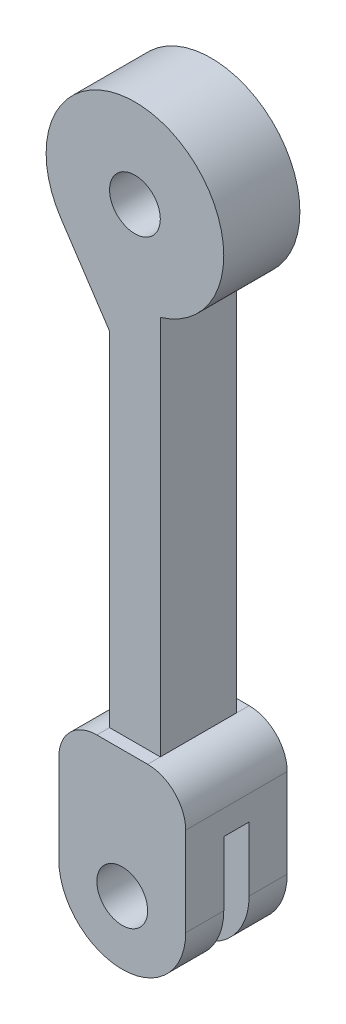
ISO-10303-21;
HEADER;
FILE_DESCRIPTION(('STEP AP214'),'2;1');
FILE_NAME('part.step','',(''),(''),'','','');
FILE_SCHEMA(('AUTOMOTIVE_DESIGN { 1 0 10303 214 1 1 1 1 }'));
ENDSEC;
DATA;
#1=APPLICATION_CONTEXT('core data for automotive mechanical design processes');
#2=APPLICATION_PROTOCOL_DEFINITION('international standard','automotive_design',2000,#1);
#3=PRODUCT_CONTEXT('',#1,'mechanical');
#4=PRODUCT('Part','Part','',(#3));
#5=PRODUCT_RELATED_PRODUCT_CATEGORY('part','',(#4));
#6=PRODUCT_DEFINITION_FORMATION('','',#4);
#7=PRODUCT_DEFINITION_CONTEXT('part definition',#1,'design');
#8=PRODUCT_DEFINITION('design','',#6,#7);
#9=PRODUCT_DEFINITION_SHAPE('','',#8);
#10=(LENGTH_UNIT() NAMED_UNIT(*) SI_UNIT(.MILLI.,.METRE.));
#11=(NAMED_UNIT(*) PLANE_ANGLE_UNIT() SI_UNIT($,.RADIAN.));
#12=(NAMED_UNIT(*) SI_UNIT($,.STERADIAN.) SOLID_ANGLE_UNIT());
#13=UNCERTAINTY_MEASURE_WITH_UNIT(LENGTH_MEASURE(1.E-05),#10,'distance_accuracy_value','');
#14=(GEOMETRIC_REPRESENTATION_CONTEXT(3) GLOBAL_UNCERTAINTY_ASSIGNED_CONTEXT((#13)) GLOBAL_UNIT_ASSIGNED_CONTEXT((#10,
#11,#12)) REPRESENTATION_CONTEXT('',''));
#15=CARTESIAN_POINT('',(0.,0.,0.));
#16=DIRECTION('',(0.,0.,1.));
#17=DIRECTION('',(1.,0.,0.));
#18=AXIS2_PLACEMENT_3D('',#15,#16,#17);
#19=CARTESIAN_POINT('',(0.,0.,4.));
#20=DIRECTION('',(0.,0.,-1.));
#21=DIRECTION('',(-1.,0.,0.));
#22=AXIS2_PLACEMENT_3D('',#19,#20,#21);
#23=CYLINDRICAL_SURFACE('',#22,2.5);
#24=DIRECTION('',(0.,0.,-1.));
#25=VECTOR('',#24,1.);
#26=CARTESIAN_POINT('',(2.5,0.,4.));
#27=LINE('',#26,#25);
#28=CARTESIAN_POINT('',(2.5,0.,1.5));
#29=VERTEX_POINT('',#28);
#30=CARTESIAN_POINT('',(2.5,0.,0.));
#31=VERTEX_POINT('',#30);
#32=EDGE_CURVE('E267',#29,#31,#27,.T.);
#33=ORIENTED_EDGE('',*,*,#32,.F.);
#34=CARTESIAN_POINT('',(0.,0.,1.5));
#35=DIRECTION('',(0.,0.,-1.));
#36=DIRECTION('',(0.,1.,0.));
#37=AXIS2_PLACEMENT_3D('',#34,#35,#36);
#38=CIRCLE('',#37,2.5);
#39=CARTESIAN_POINT('',(-2.5,0.,1.5));
#40=VERTEX_POINT('',#39);
#41=EDGE_CURVE('E151',#29,#40,#38,.T.);
#42=ORIENTED_EDGE('',*,*,#41,.T.);
#43=DIRECTION('',(0.,0.,-1.));
#44=VECTOR('',#43,1.);
#45=CARTESIAN_POINT('',(-2.5,0.,4.));
#46=LINE('',#45,#44);
#47=CARTESIAN_POINT('',(-2.5,0.,0.));
#48=VERTEX_POINT('',#47);
#49=EDGE_CURVE('E235',#40,#48,#46,.T.);
#50=ORIENTED_EDGE('',*,*,#49,.T.);
#51=CARTESIAN_POINT('',(0.,0.,0.));
#52=DIRECTION('',(0.,0.,1.));
#53=DIRECTION('',(1.,0.,0.));
#54=AXIS2_PLACEMENT_3D('',#51,#52,#53);
#55=CIRCLE('',#54,2.5);
#56=EDGE_CURVE('E218',#48,#31,#55,.T.);
#57=ORIENTED_EDGE('',*,*,#56,.T.);
#58=EDGE_LOOP('',(#33,#42,#50,#57));
#59=FACE_BOUND('',#58,.T.);
#60=ADVANCED_FACE('F32',(#59),#23,.T.);
#61=CARTESIAN_POINT('',(0.,0.,4.));
#62=DIRECTION('',(0.,0.,-1.));
#63=DIRECTION('',(-1.,0.,0.));
#64=AXIS2_PLACEMENT_3D('',#61,#62,#63);
#65=CYLINDRICAL_SURFACE('',#64,1.);
#66=CARTESIAN_POINT('',(0.,0.,1.5));
#67=DIRECTION('',(0.,0.,-1.));
#68=DIRECTION('',(0.,1.,0.));
#69=AXIS2_PLACEMENT_3D('',#66,#67,#68);
#70=CIRCLE('',#69,1.);
#71=CARTESIAN_POINT('',(0.,1.,1.5));
#72=VERTEX_POINT('',#71);
#73=EDGE_CURVE('E168',#72,#72,#70,.T.);
#74=ORIENTED_EDGE('',*,*,#73,.F.);
#75=EDGE_LOOP('',(#74));
#76=FACE_BOUND('',#75,.T.);
#77=CARTESIAN_POINT('',(0.,0.,0.));
#78=DIRECTION('',(0.,0.,1.));
#79=DIRECTION('',(1.,0.,0.));
#80=AXIS2_PLACEMENT_3D('',#77,#78,#79);
#81=CIRCLE('',#80,1.);
#82=CARTESIAN_POINT('',(1.,0.,0.));
#83=VERTEX_POINT('',#82);
#84=EDGE_CURVE('E214',#83,#83,#81,.T.);
#85=ORIENTED_EDGE('',*,*,#84,.F.);
#86=EDGE_LOOP('',(#85));
#87=FACE_BOUND('',#86,.T.);
#88=ADVANCED_FACE('F274',(#76,#87),#65,.F.);
#89=CARTESIAN_POINT('',(-0.999999999999989,5.,4.));
#90=DIRECTION('',(0.,-1.,0.));
#91=DIRECTION('',(0.,0.,-1.));
#92=AXIS2_PLACEMENT_3D('',#89,#90,#91);
#93=PLANE('',#92);
#94=DIRECTION('',(-1.,0.,0.));
#95=VECTOR('',#94,1.);
#96=CARTESIAN_POINT('',(-400000.,4.99999999999545,0.5));
#97=LINE('',#96,#95);
#98=CARTESIAN_POINT('',(0.999999999976353,4.99999999999545,0.5));
#99=VERTEX_POINT('',#98);
#100=CARTESIAN_POINT('',(-0.999999999999989,5.,0.5));
#101=VERTEX_POINT('',#100);
#102=EDGE_CURVE('E55',#99,#101,#97,.T.);
#103=ORIENTED_EDGE('',*,*,#102,.F.);
#104=DIRECTION('',(0.,0.,-1.));
#105=VECTOR('',#104,1.);
#106=CARTESIAN_POINT('',(0.99999999999999,5.,4.));
#107=LINE('',#106,#105);
#108=CARTESIAN_POINT('',(0.99999999999999,5.,0.));
#109=VERTEX_POINT('',#108);
#110=EDGE_CURVE('E260',#99,#109,#107,.T.);
#111=ORIENTED_EDGE('',*,*,#110,.T.);
#112=DIRECTION('',(-1.,0.,0.));
#113=VECTOR('',#112,1.);
#114=CARTESIAN_POINT('',(-0.999999999999989,5.,0.));
#115=LINE('',#114,#113);
#116=CARTESIAN_POINT('',(-0.999999999999989,5.,0.));
#117=VERTEX_POINT('',#116);
#118=EDGE_CURVE('E243',#109,#117,#115,.T.);
#119=ORIENTED_EDGE('',*,*,#118,.T.);
#120=DIRECTION('',(0.,0.,-1.));
#121=VECTOR('',#120,1.);
#122=CARTESIAN_POINT('',(-0.999999999999989,5.,4.));
#123=LINE('',#122,#121);
#124=EDGE_CURVE('E256',#101,#117,#123,.T.);
#125=ORIENTED_EDGE('',*,*,#124,.F.);
#126=EDGE_LOOP('',(#103,#111,#119,#125));
#127=FACE_BOUND('',#126,.T.);
#128=ADVANCED_FACE('F277',(#127),#93,.F.);
#129=CARTESIAN_POINT('',(0.,0.,4.));
#130=DIRECTION('',(0.,0.,1.));
#131=DIRECTION('',(1.,0.,0.));
#132=AXIS2_PLACEMENT_3D('',#129,#130,#131);
#133=PLANE('',#132);
#134=CARTESIAN_POINT('',(0.,0.,4.));
#135=DIRECTION('',(0.,0.,1.));
#136=DIRECTION('',(1.,0.,0.));
#137=AXIS2_PLACEMENT_3D('',#134,#135,#136);
#138=CIRCLE('',#137,2.5);
#139=CARTESIAN_POINT('',(-2.5,0.,4.));
#140=VERTEX_POINT('',#139);
#141=CARTESIAN_POINT('',(2.5,0.,4.));
#142=VERTEX_POINT('',#141);
#143=EDGE_CURVE('E221',#140,#142,#138,.T.);
#144=ORIENTED_EDGE('',*,*,#143,.T.);
#145=DIRECTION('',(0.,1.,0.));
#146=VECTOR('',#145,1.);
#147=CARTESIAN_POINT('',(2.5,3.49999999999999,4.));
#148=LINE('',#147,#146);
#149=CARTESIAN_POINT('',(2.5,3.49999999999999,4.));
#150=VERTEX_POINT('',#149);
#151=EDGE_CURVE('E224',#142,#150,#148,.T.);
#152=ORIENTED_EDGE('',*,*,#151,.T.);
#153=CARTESIAN_POINT('',(1.,3.5,4.));
#154=DIRECTION('',(0.,0.,1.));
#155=DIRECTION('',(1.,0.,0.));
#156=AXIS2_PLACEMENT_3D('',#153,#154,#155);
#157=CIRCLE('',#156,1.5);
#158=CARTESIAN_POINT('',(0.99999999999999,5.,4.));
#159=VERTEX_POINT('',#158);
#160=EDGE_CURVE('E227',#150,#159,#157,.T.);
#161=ORIENTED_EDGE('',*,*,#160,.T.);
#162=DIRECTION('',(-1.,0.,0.));
#163=VECTOR('',#162,1.);
#164=CARTESIAN_POINT('',(-0.999999999999989,5.,4.));
#165=LINE('',#164,#163);
#166=CARTESIAN_POINT('',(-0.999999999999989,5.,4.));
#167=VERTEX_POINT('',#166);
#168=EDGE_CURVE('E229',#159,#167,#165,.T.);
#169=ORIENTED_EDGE('',*,*,#168,.T.);
#170=CARTESIAN_POINT('',(-1.,3.5,4.));
#171=DIRECTION('',(0.,0.,1.));
#172=DIRECTION('',(1.,0.,0.));
#173=AXIS2_PLACEMENT_3D('',#170,#171,#172);
#174=CIRCLE('',#173,1.5);
#175=CARTESIAN_POINT('',(-2.5,3.49999999999999,4.));
#176=VERTEX_POINT('',#175);
#177=EDGE_CURVE('E231',#167,#176,#174,.T.);
#178=ORIENTED_EDGE('',*,*,#177,.T.);
#179=DIRECTION('',(0.,-1.,0.));
#180=VECTOR('',#179,1.);
#181=CARTESIAN_POINT('',(-2.5,0.,4.));
#182=LINE('',#181,#180);
#183=EDGE_CURVE('E233',#176,#140,#182,.T.);
#184=ORIENTED_EDGE('',*,*,#183,.T.);
#185=EDGE_LOOP('',(#144,#152,#161,#169,#178,#184));
#186=FACE_BOUND('',#185,.T.);
#187=CARTESIAN_POINT('',(0.,0.,4.));
#188=DIRECTION('',(0.,0.,1.));
#189=DIRECTION('',(1.,0.,0.));
#190=AXIS2_PLACEMENT_3D('',#187,#188,#189);
#191=CIRCLE('',#190,1.);
#192=CARTESIAN_POINT('',(1.,0.,4.));
#193=VERTEX_POINT('',#192);
#194=EDGE_CURVE('E215',#193,#193,#191,.T.);
#195=ORIENTED_EDGE('',*,*,#194,.F.);
#196=EDGE_LOOP('',(#195));
#197=FACE_BOUND('',#196,.T.);
#198=ADVANCED_FACE('F284',(#186,#197),#133,.T.);
#199=CARTESIAN_POINT('',(0.,0.,0.));
#200=DIRECTION('',(0.,0.,1.));
#201=DIRECTION('',(1.,0.,0.));
#202=AXIS2_PLACEMENT_3D('',#199,#200,#201);
#203=PLANE('',#202);
#204=ORIENTED_EDGE('',*,*,#56,.F.);
#205=DIRECTION('',(0.,-1.,0.));
#206=VECTOR('',#205,1.);
#207=CARTESIAN_POINT('',(-2.5,0.,0.));
#208=LINE('',#207,#206);
#209=CARTESIAN_POINT('',(-2.5,3.49999999999999,0.));
#210=VERTEX_POINT('',#209);
#211=EDGE_CURVE('E225',#210,#48,#208,.T.);
#212=ORIENTED_EDGE('',*,*,#211,.F.);
#213=CARTESIAN_POINT('',(-1.,3.5,0.));
#214=DIRECTION('',(0.,0.,1.));
#215=DIRECTION('',(1.,0.,0.));
#216=AXIS2_PLACEMENT_3D('',#213,#214,#215);
#217=CIRCLE('',#216,1.5);
#218=EDGE_CURVE('E246',#117,#210,#217,.T.);
#219=ORIENTED_EDGE('',*,*,#218,.F.);
#220=ORIENTED_EDGE('',*,*,#118,.F.);
#221=CARTESIAN_POINT('',(1.,3.5,0.));
#222=DIRECTION('',(0.,0.,1.));
#223=DIRECTION('',(1.,0.,0.));
#224=AXIS2_PLACEMENT_3D('',#221,#222,#223);
#225=CIRCLE('',#224,1.5);
#226=CARTESIAN_POINT('',(2.5,3.49999999999999,0.));
#227=VERTEX_POINT('',#226);
#228=EDGE_CURVE('E240',#227,#109,#225,.T.);
#229=ORIENTED_EDGE('',*,*,#228,.F.);
#230=DIRECTION('',(0.,1.,0.));
#231=VECTOR('',#230,1.);
#232=CARTESIAN_POINT('',(2.5,3.49999999999999,0.));
#233=LINE('',#232,#231);
#234=EDGE_CURVE('E238',#31,#227,#233,.T.);
#235=ORIENTED_EDGE('',*,*,#234,.F.);
#236=EDGE_LOOP('',(#204,#212,#219,#220,#229,#235));
#237=FACE_BOUND('',#236,.T.);
#238=ORIENTED_EDGE('',*,*,#84,.T.);
#239=EDGE_LOOP('',(#238));
#240=FACE_BOUND('',#239,.T.);
#241=ADVANCED_FACE('F282',(#237,#240),#203,.F.);
#242=CARTESIAN_POINT('',(-2.5,0.,2.5));
#243=VERTEX_POINT('',#242);
#244=EDGE_CURVE('E250',#140,#243,#46,.T.);
#245=ORIENTED_EDGE('',*,*,#244,.T.);
#246=CARTESIAN_POINT('',(0.,0.,2.5));
#247=DIRECTION('',(0.,0.,1.));
#248=DIRECTION('',(0.,-1.,0.));
#249=AXIS2_PLACEMENT_3D('',#246,#247,#248);
#250=CIRCLE('',#249,2.5);
#251=CARTESIAN_POINT('',(2.5,0.,2.5));
#252=VERTEX_POINT('',#251);
#253=EDGE_CURVE('E165',#243,#252,#250,.T.);
#254=ORIENTED_EDGE('',*,*,#253,.T.);
#255=EDGE_CURVE('E40',#142,#252,#27,.T.);
#256=ORIENTED_EDGE('',*,*,#255,.F.);
#257=ORIENTED_EDGE('',*,*,#143,.F.);
#258=EDGE_LOOP('',(#245,#254,#256,#257));
#259=FACE_BOUND('',#258,.T.);
#260=ADVANCED_FACE('F34',(#259),#23,.T.);
#261=CARTESIAN_POINT('',(2.5,3.49999999999999,4.));
#262=DIRECTION('',(-1.,0.,0.));
#263=DIRECTION('',(0.,-1.,0.));
#264=AXIS2_PLACEMENT_3D('',#261,#262,#263);
#265=PLANE('',#264);
#266=DIRECTION('',(0.,0.,1.));
#267=VECTOR('',#266,1.);
#268=CARTESIAN_POINT('',(2.5,2.53048513073797,1.5));
#269=LINE('',#268,#267);
#270=CARTESIAN_POINT('',(2.5,2.53048513073797,1.5));
#271=VERTEX_POINT('',#270);
#272=CARTESIAN_POINT('',(2.5,2.53048513073797,2.5));
#273=VERTEX_POINT('',#272);
#274=EDGE_CURVE('E141',#271,#273,#269,.T.);
#275=ORIENTED_EDGE('',*,*,#274,.F.);
#276=DIRECTION('',(0.,1.,0.));
#277=VECTOR('',#276,1.);
#278=CARTESIAN_POINT('',(2.5,2.53048513073797,1.5));
#279=LINE('',#278,#277);
#280=EDGE_CURVE('E148',#29,#271,#279,.T.);
#281=ORIENTED_EDGE('',*,*,#280,.F.);
#282=ORIENTED_EDGE('',*,*,#32,.T.);
#283=ORIENTED_EDGE('',*,*,#234,.T.);
#284=DIRECTION('',(0.,0.,-1.));
#285=VECTOR('',#284,1.);
#286=CARTESIAN_POINT('',(2.5,3.49999999999999,4.));
#287=LINE('',#286,#285);
#288=EDGE_CURVE('E264',#150,#227,#287,.T.);
#289=ORIENTED_EDGE('',*,*,#288,.F.);
#290=ORIENTED_EDGE('',*,*,#151,.F.);
#291=ORIENTED_EDGE('',*,*,#255,.T.);
#292=DIRECTION('',(0.,-1.,0.));
#293=VECTOR('',#292,1.);
#294=CARTESIAN_POINT('',(2.5,2.53048513073797,2.5));
#295=LINE('',#294,#293);
#296=EDGE_CURVE('E145',#273,#252,#295,.T.);
#297=ORIENTED_EDGE('',*,*,#296,.F.);
#298=EDGE_LOOP('',(#275,#281,#282,#283,#289,#290,#291,#297));
#299=FACE_BOUND('',#298,.T.);
#300=ADVANCED_FACE('F155',(#299),#265,.F.);
#301=CARTESIAN_POINT('',(1.,3.5,4.));
#302=DIRECTION('',(0.,0.,-1.));
#303=DIRECTION('',(-1.,0.,0.));
#304=AXIS2_PLACEMENT_3D('',#301,#302,#303);
#305=CYLINDRICAL_SURFACE('',#304,1.5);
#306=ORIENTED_EDGE('',*,*,#228,.T.);
#307=ORIENTED_EDGE('',*,*,#110,.F.);
#308=DIRECTION('',(0.,0.,1.));
#309=VECTOR('',#308,1.);
#310=CARTESIAN_POINT('',(0.999999999976353,4.99999999999545,0.5));
#311=LINE('',#310,#309);
#312=CARTESIAN_POINT('',(0.999999999976353,4.99999999999545,3.5));
#313=VERTEX_POINT('',#312);
#314=EDGE_CURVE('E203',#99,#313,#311,.T.);
#315=ORIENTED_EDGE('',*,*,#314,.T.);
#316=EDGE_CURVE('E261',#159,#313,#107,.T.);
#317=ORIENTED_EDGE('',*,*,#316,.F.);
#318=ORIENTED_EDGE('',*,*,#160,.F.);
#319=ORIENTED_EDGE('',*,*,#288,.T.);
#320=EDGE_LOOP('',(#306,#307,#315,#317,#318,#319));
#321=FACE_BOUND('',#320,.T.);
#322=ADVANCED_FACE('F309',(#321),#305,.T.);
#323=ORIENTED_EDGE('',*,*,#316,.T.);
#324=DIRECTION('',(-1.,0.,0.));
#325=VECTOR('',#324,1.);
#326=CARTESIAN_POINT('',(-400000.,4.99999999999545,3.5));
#327=LINE('',#326,#325);
#328=CARTESIAN_POINT('',(-1.00000000000427,4.99999999999545,3.5));
#329=VERTEX_POINT('',#328);
#330=EDGE_CURVE('E175',#313,#329,#327,.T.);
#331=ORIENTED_EDGE('',*,*,#330,.T.);
#332=EDGE_CURVE('E257',#167,#329,#123,.T.);
#333=ORIENTED_EDGE('',*,*,#332,.F.);
#334=ORIENTED_EDGE('',*,*,#168,.F.);
#335=EDGE_LOOP('',(#323,#331,#333,#334));
#336=FACE_BOUND('',#335,.T.);
#337=ADVANCED_FACE('F330',(#336),#93,.F.);
#338=CARTESIAN_POINT('',(-1.,3.5,4.));
#339=DIRECTION('',(0.,0.,-1.));
#340=DIRECTION('',(-1.,0.,0.));
#341=AXIS2_PLACEMENT_3D('',#338,#339,#340);
#342=CYLINDRICAL_SURFACE('',#341,1.5);
#343=ORIENTED_EDGE('',*,*,#218,.T.);
#344=DIRECTION('',(0.,0.,-1.));
#345=VECTOR('',#344,1.);
#346=CARTESIAN_POINT('',(-2.5,3.49999999999999,4.));
#347=LINE('',#346,#345);
#348=EDGE_CURVE('E253',#176,#210,#347,.T.);
#349=ORIENTED_EDGE('',*,*,#348,.F.);
#350=ORIENTED_EDGE('',*,*,#177,.F.);
#351=ORIENTED_EDGE('',*,*,#332,.T.);
#352=DIRECTION('',(0.,0.,1.));
#353=VECTOR('',#352,1.);
#354=CARTESIAN_POINT('',(-1.00000000000427,4.99999999999545,0.5));
#355=LINE('',#354,#353);
#356=EDGE_CURVE('E212',#101,#329,#355,.T.);
#357=ORIENTED_EDGE('',*,*,#356,.F.);
#358=ORIENTED_EDGE('',*,*,#124,.T.);
#359=EDGE_LOOP('',(#343,#349,#350,#351,#357,#358));
#360=FACE_BOUND('',#359,.T.);
#361=ADVANCED_FACE('F323',(#360),#342,.T.);
#362=CARTESIAN_POINT('',(-2.5,0.,4.));
#363=DIRECTION('',(1.,0.,0.));
#364=DIRECTION('',(0.,1.,0.));
#365=AXIS2_PLACEMENT_3D('',#362,#363,#364);
#366=PLANE('',#365);
#367=ORIENTED_EDGE('',*,*,#49,.F.);
#368=DIRECTION('',(0.,1.,0.));
#369=VECTOR('',#368,1.);
#370=CARTESIAN_POINT('',(-2.5,0.,1.5));
#371=LINE('',#370,#369);
#372=CARTESIAN_POINT('',(-2.5,2.53048513073797,1.5));
#373=VERTEX_POINT('',#372);
#374=EDGE_CURVE('E169',#40,#373,#371,.T.);
#375=ORIENTED_EDGE('',*,*,#374,.T.);
#376=DIRECTION('',(0.,0.,1.));
#377=VECTOR('',#376,1.);
#378=CARTESIAN_POINT('',(-2.5,2.53048513073797,4.));
#379=LINE('',#378,#377);
#380=CARTESIAN_POINT('',(-2.5,2.53048513073797,2.5));
#381=VERTEX_POINT('',#380);
#382=EDGE_CURVE('E11',#373,#381,#379,.T.);
#383=ORIENTED_EDGE('',*,*,#382,.T.);
#384=DIRECTION('',(0.,-1.,0.));
#385=VECTOR('',#384,1.);
#386=CARTESIAN_POINT('',(-2.5,0.,2.5));
#387=LINE('',#386,#385);
#388=EDGE_CURVE('E162',#381,#243,#387,.T.);
#389=ORIENTED_EDGE('',*,*,#388,.T.);
#390=ORIENTED_EDGE('',*,*,#244,.F.);
#391=ORIENTED_EDGE('',*,*,#183,.F.);
#392=ORIENTED_EDGE('',*,*,#348,.T.);
#393=ORIENTED_EDGE('',*,*,#211,.T.);
#394=EDGE_LOOP('',(#367,#375,#383,#389,#390,#391,#392,#393));
#395=FACE_BOUND('',#394,.T.);
#396=ADVANCED_FACE('F320',(#395),#366,.F.);
#397=CARTESIAN_POINT('',(0.,0.,2.5));
#398=DIRECTION('',(0.,0.,1.));
#399=DIRECTION('',(0.,-1.,0.));
#400=AXIS2_PLACEMENT_3D('',#397,#398,#399);
#401=CIRCLE('',#400,1.);
#402=CARTESIAN_POINT('',(0.,-1.,2.5));
#403=VERTEX_POINT('',#402);
#404=EDGE_CURVE('E160',#403,#403,#401,.T.);
#405=ORIENTED_EDGE('',*,*,#404,.F.);
#406=EDGE_LOOP('',(#405));
#407=FACE_BOUND('',#406,.T.);
#408=ORIENTED_EDGE('',*,*,#194,.T.);
#409=EDGE_LOOP('',(#408));
#410=FACE_BOUND('',#409,.T.);
#411=ADVANCED_FACE('F279',(#407,#410),#65,.F.);
#412=CARTESIAN_POINT('',(-1.00000000031741,-291594.625,0.5));
#413=DIRECTION('',(1.,0.,0.));
#414=DIRECTION('',(0.,1.,0.));
#415=AXIS2_PLACEMENT_3D('',#412,#413,#414);
#416=PLANE('',#415);
#417=ORIENTED_EDGE('',*,*,#356,.T.);
#418=DIRECTION('',(0.,1.,0.));
#419=VECTOR('',#418,1.);
#420=CARTESIAN_POINT('',(-1.00000000031741,-291594.625,3.5));
#421=LINE('',#420,#419);
#422=CARTESIAN_POINT('',(-1.00000000006695,18.5289622188129,3.5));
#423=VERTEX_POINT('',#422);
#424=EDGE_CURVE('E178',#329,#423,#421,.T.);
#425=ORIENTED_EDGE('',*,*,#424,.T.);
#426=DIRECTION('',(0.,0.,1.));
#427=VECTOR('',#426,1.);
#428=CARTESIAN_POINT('',(-1.00000000006695,18.5289622188129,0.5));
#429=LINE('',#428,#427);
#430=CARTESIAN_POINT('',(-1.00000000006695,18.5289622188129,0.5));
#431=VERTEX_POINT('',#430);
#432=EDGE_CURVE('E210',#431,#423,#429,.T.);
#433=ORIENTED_EDGE('',*,*,#432,.F.);
#434=DIRECTION('',(0.,1.,0.));
#435=VECTOR('',#434,1.);
#436=CARTESIAN_POINT('',(-1.00000000031741,-291594.625,0.5));
#437=LINE('',#436,#435);
#438=EDGE_CURVE('E194',#101,#431,#437,.T.);
#439=ORIENTED_EDGE('',*,*,#438,.F.);
#440=EDGE_LOOP('',(#417,#425,#433,#439));
#441=FACE_BOUND('',#440,.T.);
#442=ADVANCED_FACE('F357',(#441),#416,.F.);
#443=CARTESIAN_POINT('',(12145.3955189323,-18298.9233624384,0.5));
#444=DIRECTION('',(0.833417740021807,0.552643529426468,0.));
#445=DIRECTION('',(-0.552643529426469,0.833417740021807,0.));
#446=AXIS2_PLACEMENT_3D('',#443,#444,#445);
#447=PLANE('',#446);
#448=ORIENTED_EDGE('',*,*,#432,.T.);
#449=DIRECTION('',(-0.552643529426469,0.833417740021807,0.));
#450=VECTOR('',#449,1.);
#451=CARTESIAN_POINT('',(12145.3955189323,-18298.9233624384,3.5));
#452=LINE('',#451,#450);
#453=CARTESIAN_POINT('',(-2.91696209007783,21.4198496132593,3.5));
#454=VERTEX_POINT('',#453);
#455=EDGE_CURVE('E181',#423,#454,#452,.T.);
#456=ORIENTED_EDGE('',*,*,#455,.T.);
#457=DIRECTION('',(0.,0.,1.));
#458=VECTOR('',#457,1.);
#459=CARTESIAN_POINT('',(-2.91696209007783,21.4198496132593,0.5));
#460=LINE('',#459,#458);
#461=CARTESIAN_POINT('',(-2.91696209007783,21.4198496132593,0.5));
#462=VERTEX_POINT('',#461);
#463=EDGE_CURVE('E208',#462,#454,#460,.T.);
#464=ORIENTED_EDGE('',*,*,#463,.F.);
#465=DIRECTION('',(-0.552643529426469,0.833417740021807,0.));
#466=VECTOR('',#465,1.);
#467=CARTESIAN_POINT('',(12145.3955189323,-18298.9233624384,0.5));
#468=LINE('',#467,#466);
#469=EDGE_CURVE('E196',#431,#462,#468,.T.);
#470=ORIENTED_EDGE('',*,*,#469,.F.);
#471=EDGE_LOOP('',(#448,#456,#464,#470));
#472=FACE_BOUND('',#471,.T.);
#473=ADVANCED_FACE('F362',(#472),#447,.F.);
#474=CARTESIAN_POINT('',(0.,23.3541019662497,0.5));
#475=DIRECTION('',(0.,0.,1.));
#476=DIRECTION('',(1.,0.,0.));
#477=AXIS2_PLACEMENT_3D('',#474,#475,#476);
#478=CYLINDRICAL_SURFACE('',#477,3.5);
#479=ORIENTED_EDGE('',*,*,#463,.T.);
#480=CARTESIAN_POINT('',(0.,23.3541019662497,3.5));
#481=DIRECTION('',(0.,0.,1.));
#482=DIRECTION('',(1.,0.,0.));
#483=AXIS2_PLACEMENT_3D('',#480,#481,#482);
#484=CIRCLE('',#483,3.5);
#485=CARTESIAN_POINT('',(0.999999999976353,19.9999999999818,3.5));
#486=VERTEX_POINT('',#485);
#487=EDGE_CURVE('E184',#486,#454,#484,.T.);
#488=ORIENTED_EDGE('',*,*,#487,.F.);
#489=DIRECTION('',(0.,0.,1.));
#490=VECTOR('',#489,1.);
#491=CARTESIAN_POINT('',(0.999999999976353,19.9999999999818,0.5));
#492=LINE('',#491,#490);
#493=CARTESIAN_POINT('',(0.999999999976353,19.9999999999818,0.5));
#494=VERTEX_POINT('',#493);
#495=EDGE_CURVE('E206',#494,#486,#492,.T.);
#496=ORIENTED_EDGE('',*,*,#495,.F.);
#497=CARTESIAN_POINT('',(0.,23.3541019662497,0.5));
#498=DIRECTION('',(0.,0.,1.));
#499=DIRECTION('',(1.,0.,0.));
#500=AXIS2_PLACEMENT_3D('',#497,#498,#499);
#501=CIRCLE('',#500,3.5);
#502=EDGE_CURVE('E198',#494,#462,#501,.T.);
#503=ORIENTED_EDGE('',*,*,#502,.T.);
#504=EDGE_LOOP('',(#479,#488,#496,#503));
#505=FACE_BOUND('',#504,.T.);
#506=ADVANCED_FACE('F364',(#505),#478,.T.);
#507=CARTESIAN_POINT('',(0.999999999976353,-291594.625,0.5));
#508=DIRECTION('',(-1.,0.,0.));
#509=DIRECTION('',(0.,0.,1.));
#510=AXIS2_PLACEMENT_3D('',#507,#508,#509);
#511=PLANE('',#510);
#512=ORIENTED_EDGE('',*,*,#495,.T.);
#513=DIRECTION('',(0.,-1.,0.));
#514=VECTOR('',#513,1.);
#515=CARTESIAN_POINT('',(0.999999999976353,-291594.625,3.5));
#516=LINE('',#515,#514);
#517=EDGE_CURVE('E187',#486,#313,#516,.T.);
#518=ORIENTED_EDGE('',*,*,#517,.T.);
#519=ORIENTED_EDGE('',*,*,#314,.F.);
#520=DIRECTION('',(0.,-1.,0.));
#521=VECTOR('',#520,1.);
#522=CARTESIAN_POINT('',(0.999999999976353,-291594.625,0.5));
#523=LINE('',#522,#521);
#524=EDGE_CURVE('E201',#494,#99,#523,.T.);
#525=ORIENTED_EDGE('',*,*,#524,.F.);
#526=EDGE_LOOP('',(#512,#518,#519,#525));
#527=FACE_BOUND('',#526,.T.);
#528=ADVANCED_FACE('F346',(#527),#511,.F.);
#529=CARTESIAN_POINT('',(0.,23.3541019662497,0.5));
#530=DIRECTION('',(0.,0.,1.));
#531=DIRECTION('',(1.,0.,0.));
#532=AXIS2_PLACEMENT_3D('',#529,#530,#531);
#533=PLANE('',#532);
#534=CARTESIAN_POINT('',(0.,23.3541019662497,0.5));
#535=DIRECTION('',(0.,0.,1.));
#536=DIRECTION('',(1.,0.,0.));
#537=AXIS2_PLACEMENT_3D('',#534,#535,#536);
#538=CIRCLE('',#537,1.);
#539=CARTESIAN_POINT('',(1.,23.3541019662497,0.5));
#540=VERTEX_POINT('',#539);
#541=EDGE_CURVE('E190',#540,#540,#538,.T.);
#542=ORIENTED_EDGE('',*,*,#541,.T.);
#543=EDGE_LOOP('',(#542));
#544=FACE_BOUND('',#543,.T.);
#545=ORIENTED_EDGE('',*,*,#102,.T.);
#546=ORIENTED_EDGE('',*,*,#438,.T.);
#547=ORIENTED_EDGE('',*,*,#469,.T.);
#548=ORIENTED_EDGE('',*,*,#502,.F.);
#549=ORIENTED_EDGE('',*,*,#524,.T.);
#550=EDGE_LOOP('',(#545,#546,#547,#548,#549));
#551=FACE_BOUND('',#550,.T.);
#552=ADVANCED_FACE('F359',(#544,#551),#533,.F.);
#553=CARTESIAN_POINT('',(0.,23.3541019662497,0.5));
#554=DIRECTION('',(0.,0.,1.));
#555=DIRECTION('',(1.,0.,0.));
#556=AXIS2_PLACEMENT_3D('',#553,#554,#555);
#557=CYLINDRICAL_SURFACE('',#556,1.);
#558=ORIENTED_EDGE('',*,*,#541,.F.);
#559=EDGE_LOOP('',(#558));
#560=FACE_BOUND('',#559,.T.);
#561=CARTESIAN_POINT('',(0.,23.3541019662497,3.5));
#562=DIRECTION('',(0.,0.,1.));
#563=DIRECTION('',(1.,0.,0.));
#564=AXIS2_PLACEMENT_3D('',#561,#562,#563);
#565=CIRCLE('',#564,1.);
#566=CARTESIAN_POINT('',(1.,23.3541019662497,3.5));
#567=VERTEX_POINT('',#566);
#568=EDGE_CURVE('E172',#567,#567,#565,.T.);
#569=ORIENTED_EDGE('',*,*,#568,.T.);
#570=EDGE_LOOP('',(#569));
#571=FACE_BOUND('',#570,.T.);
#572=ADVANCED_FACE('F396',(#560,#571),#557,.F.);
#573=CARTESIAN_POINT('',(0.,23.3541019662497,3.5));
#574=DIRECTION('',(0.,0.,1.));
#575=DIRECTION('',(1.,0.,0.));
#576=AXIS2_PLACEMENT_3D('',#573,#574,#575);
#577=PLANE('',#576);
#578=ORIENTED_EDGE('',*,*,#330,.F.);
#579=ORIENTED_EDGE('',*,*,#517,.F.);
#580=ORIENTED_EDGE('',*,*,#487,.T.);
#581=ORIENTED_EDGE('',*,*,#455,.F.);
#582=ORIENTED_EDGE('',*,*,#424,.F.);
#583=EDGE_LOOP('',(#578,#579,#580,#581,#582));
#584=FACE_BOUND('',#583,.T.);
#585=ORIENTED_EDGE('',*,*,#568,.F.);
#586=EDGE_LOOP('',(#585));
#587=FACE_BOUND('',#586,.T.);
#588=ADVANCED_FACE('F351',(#584,#587),#577,.T.);
#589=CARTESIAN_POINT('',(-7.5,2.53048513073797,1.5));
#590=DIRECTION('',(0.,1.,0.));
#591=DIRECTION('',(0.,0.,1.));
#592=AXIS2_PLACEMENT_3D('',#589,#590,#591);
#593=PLANE('',#592);
#594=DIRECTION('',(1.,0.,0.));
#595=VECTOR('',#594,1.);
#596=CARTESIAN_POINT('',(-7.5,2.53048513073797,1.5));
#597=LINE('',#596,#595);
#598=EDGE_CURVE('E137',#373,#271,#597,.T.);
#599=ORIENTED_EDGE('',*,*,#598,.T.);
#600=ORIENTED_EDGE('',*,*,#274,.T.);
#601=DIRECTION('',(1.,0.,0.));
#602=VECTOR('',#601,1.);
#603=CARTESIAN_POINT('',(-7.5,2.53048513073797,2.5));
#604=LINE('',#603,#602);
#605=EDGE_CURVE('E47',#381,#273,#604,.T.);
#606=ORIENTED_EDGE('',*,*,#605,.F.);
#607=ORIENTED_EDGE('',*,*,#382,.F.);
#608=EDGE_LOOP('',(#599,#600,#606,#607));
#609=FACE_BOUND('',#608,.T.);
#610=ADVANCED_FACE('F139',(#609),#593,.F.);
#611=CARTESIAN_POINT('',(-7.5,2.53048513073797,1.5));
#612=DIRECTION('',(0.,0.,-1.));
#613=DIRECTION('',(0.,1.,0.));
#614=AXIS2_PLACEMENT_3D('',#611,#612,#613);
#615=PLANE('',#614);
#616=ORIENTED_EDGE('',*,*,#73,.T.);
#617=EDGE_LOOP('',(#616));
#618=FACE_BOUND('',#617,.T.);
#619=ORIENTED_EDGE('',*,*,#280,.T.);
#620=ORIENTED_EDGE('',*,*,#598,.F.);
#621=ORIENTED_EDGE('',*,*,#374,.F.);
#622=ORIENTED_EDGE('',*,*,#41,.F.);
#623=EDGE_LOOP('',(#619,#620,#621,#622));
#624=FACE_BOUND('',#623,.T.);
#625=ADVANCED_FACE('F149',(#618,#624),#615,.F.);
#626=CARTESIAN_POINT('',(-7.5,2.53048513073797,2.5));
#627=DIRECTION('',(0.,0.,1.));
#628=DIRECTION('',(0.,-1.,0.));
#629=AXIS2_PLACEMENT_3D('',#626,#627,#628);
#630=PLANE('',#629);
#631=ORIENTED_EDGE('',*,*,#404,.T.);
#632=EDGE_LOOP('',(#631));
#633=FACE_BOUND('',#632,.T.);
#634=ORIENTED_EDGE('',*,*,#388,.F.);
#635=ORIENTED_EDGE('',*,*,#605,.T.);
#636=ORIENTED_EDGE('',*,*,#296,.T.);
#637=ORIENTED_EDGE('',*,*,#253,.F.);
#638=EDGE_LOOP('',(#634,#635,#636,#637));
#639=FACE_BOUND('',#638,.T.);
#640=ADVANCED_FACE('F318',(#633,#639),#630,.F.);
#641=CLOSED_SHELL('',(#60,#88,#128,#198,#241,#260,#300,#322,#337,#361,#396,#411,#442,#473,#506,
#528,#552,#572,#588,#610,#625,#640));
#642=MANIFOLD_SOLID_BREP('B2',#641);
#643=ADVANCED_BREP_SHAPE_REPRESENTATION('',(#18,#642),#14);
#644=SHAPE_DEFINITION_REPRESENTATION(#9,#643);
ENDSEC;
END-ISO-10303-21;
